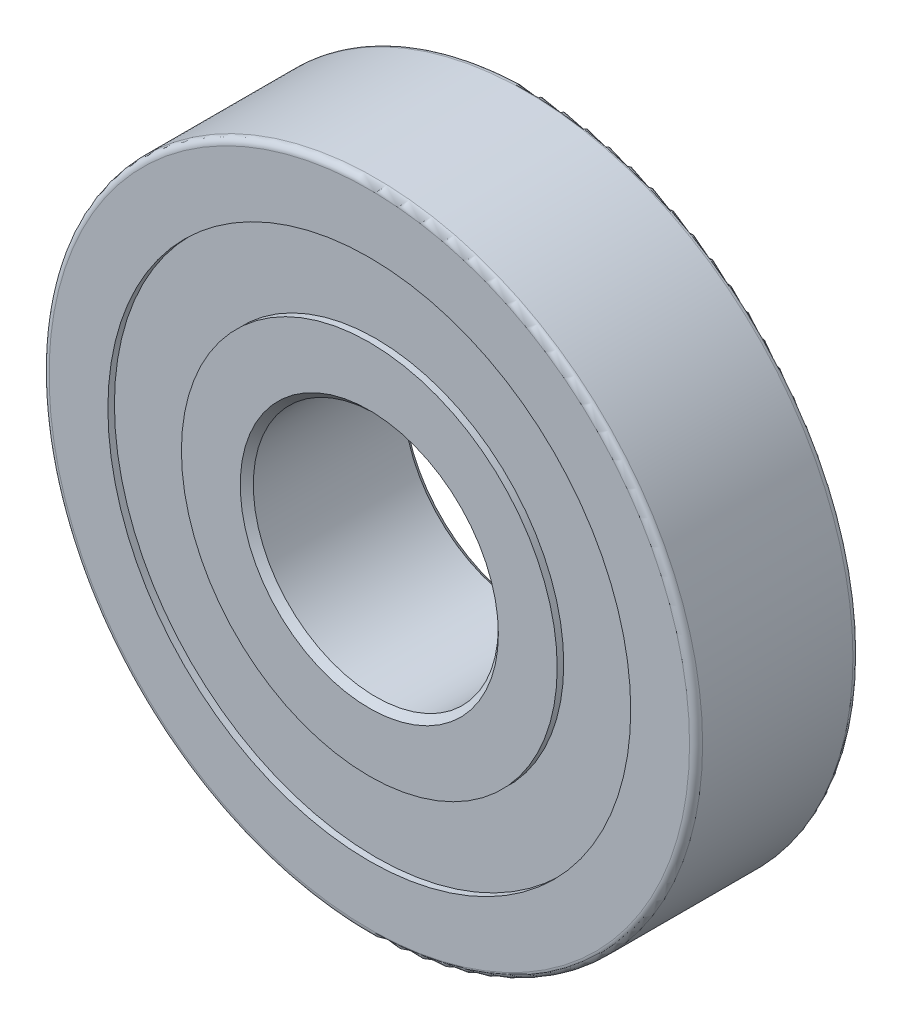
ISO-10303-21;
HEADER;
FILE_DESCRIPTION(('STEP AP214'),'2;1');
FILE_NAME('part.step','',(''),(''),'','','');
FILE_SCHEMA(('AUTOMOTIVE_DESIGN { 1 0 10303 214 1 1 1 1 }'));
ENDSEC;
DATA;
#1=APPLICATION_CONTEXT('core data for automotive mechanical design processes');
#2=APPLICATION_PROTOCOL_DEFINITION('international standard','automotive_design',2000,#1);
#3=PRODUCT_CONTEXT('',#1,'mechanical');
#4=PRODUCT('Part','Part','',(#3));
#5=PRODUCT_RELATED_PRODUCT_CATEGORY('part','',(#4));
#6=PRODUCT_DEFINITION_FORMATION('','',#4);
#7=PRODUCT_DEFINITION_CONTEXT('part definition',#1,'design');
#8=PRODUCT_DEFINITION('design','',#6,#7);
#9=PRODUCT_DEFINITION_SHAPE('','',#8);
#10=(LENGTH_UNIT() NAMED_UNIT(*) SI_UNIT(.MILLI.,.METRE.));
#11=(NAMED_UNIT(*) PLANE_ANGLE_UNIT() SI_UNIT($,.RADIAN.));
#12=(NAMED_UNIT(*) SI_UNIT($,.STERADIAN.) SOLID_ANGLE_UNIT());
#13=UNCERTAINTY_MEASURE_WITH_UNIT(LENGTH_MEASURE(1.E-05),#10,'distance_accuracy_value','');
#14=(GEOMETRIC_REPRESENTATION_CONTEXT(3) GLOBAL_UNCERTAINTY_ASSIGNED_CONTEXT((#13)) GLOBAL_UNIT_ASSIGNED_CONTEXT((#10,
#11,#12)) REPRESENTATION_CONTEXT('',''));
#15=CARTESIAN_POINT('',(0.,0.,0.));
#16=DIRECTION('',(0.,0.,1.));
#17=DIRECTION('',(1.,0.,0.));
#18=AXIS2_PLACEMENT_3D('',#15,#16,#17);
#19=CARTESIAN_POINT('',(0.,0.,1.5875));
#20=DIRECTION('',(0.,0.,-1.));
#21=DIRECTION('',(-1.,0.,0.));
#22=AXIS2_PLACEMENT_3D('',#19,#20,#21);
#23=CYLINDRICAL_SURFACE('',#22,5.08);
#24=CARTESIAN_POINT('',(0.,0.,-1.5875));
#25=DIRECTION('',(0.,0.,1.));
#26=DIRECTION('',(1.,0.,0.));
#27=AXIS2_PLACEMENT_3D('',#24,#25,#26);
#28=CIRCLE('',#27,5.08);
#29=CARTESIAN_POINT('',(5.08,0.,-1.5875));
#30=VERTEX_POINT('',#29);
#31=EDGE_CURVE('E72',#30,#30,#28,.T.);
#32=ORIENTED_EDGE('',*,*,#31,.F.);
#33=EDGE_LOOP('',(#32));
#34=FACE_BOUND('',#33,.T.);
#35=CARTESIAN_POINT('',(0.,0.,-1.4605));
#36=DIRECTION('',(0.,0.,1.));
#37=DIRECTION('',(1.,0.,0.));
#38=AXIS2_PLACEMENT_3D('',#35,#36,#37);
#39=CIRCLE('',#38,5.08);
#40=CARTESIAN_POINT('',(5.08,0.,-1.4605));
#41=VERTEX_POINT('',#40);
#42=EDGE_CURVE('E75',#41,#41,#39,.T.);
#43=ORIENTED_EDGE('',*,*,#42,.T.);
#44=EDGE_LOOP('',(#43));
#45=FACE_BOUND('',#44,.T.);
#46=ADVANCED_FACE('F36',(#34,#45),#23,.F.);
#47=CARTESIAN_POINT('',(0.,0.,1.4605));
#48=DIRECTION('',(0.,0.,1.));
#49=DIRECTION('',(1.,0.,0.));
#50=AXIS2_PLACEMENT_3D('',#47,#48,#49);
#51=CIRCLE('',#50,5.08);
#52=CARTESIAN_POINT('',(5.08,0.,1.4605));
#53=VERTEX_POINT('',#52);
#54=EDGE_CURVE('E68',#53,#53,#51,.T.);
#55=ORIENTED_EDGE('',*,*,#54,.F.);
#56=EDGE_LOOP('',(#55));
#57=FACE_BOUND('',#56,.T.);
#58=CARTESIAN_POINT('',(0.,0.,1.5875));
#59=DIRECTION('',(0.,0.,1.));
#60=DIRECTION('',(1.,0.,0.));
#61=AXIS2_PLACEMENT_3D('',#58,#59,#60);
#62=CIRCLE('',#61,5.08);
#63=CARTESIAN_POINT('',(5.08,0.,1.5875));
#64=VERTEX_POINT('',#63);
#65=EDGE_CURVE('E71',#64,#64,#62,.T.);
#66=ORIENTED_EDGE('',*,*,#65,.T.);
#67=EDGE_LOOP('',(#66));
#68=FACE_BOUND('',#67,.T.);
#69=ADVANCED_FACE('F113',(#57,#68),#23,.F.);
#70=CARTESIAN_POINT('',(0.,0.,1.5875));
#71=DIRECTION('',(0.,0.,-1.));
#72=DIRECTION('',(-1.,0.,0.));
#73=AXIS2_PLACEMENT_3D('',#70,#71,#72);
#74=CYLINDRICAL_SURFACE('',#73,6.35);
#75=CARTESIAN_POINT('',(0.,0.,-1.4605));
#76=DIRECTION('',(0.,0.,1.));
#77=DIRECTION('',(1.,0.,0.));
#78=AXIS2_PLACEMENT_3D('',#75,#76,#77);
#79=CIRCLE('',#78,6.35);
#80=CARTESIAN_POINT('',(6.35,0.,-1.4605));
#81=VERTEX_POINT('',#80);
#82=EDGE_CURVE('E62',#81,#81,#79,.T.);
#83=ORIENTED_EDGE('',*,*,#82,.T.);
#84=EDGE_LOOP('',(#83));
#85=FACE_BOUND('',#84,.T.);
#86=CARTESIAN_POINT('',(0.,0.,1.4605));
#87=DIRECTION('',(0.,0.,1.));
#88=DIRECTION('',(1.,0.,0.));
#89=AXIS2_PLACEMENT_3D('',#86,#87,#88);
#90=CIRCLE('',#89,6.35);
#91=CARTESIAN_POINT('',(6.35,0.,1.4605));
#92=VERTEX_POINT('',#91);
#93=EDGE_CURVE('E65',#92,#92,#90,.F.);
#94=ORIENTED_EDGE('',*,*,#93,.T.);
#95=EDGE_LOOP('',(#94));
#96=FACE_BOUND('',#95,.T.);
#97=ADVANCED_FACE('F119',(#85,#96),#74,.T.);
#98=CARTESIAN_POINT('',(0.,0.,1.5875));
#99=DIRECTION('',(0.,0.,1.));
#100=DIRECTION('',(1.,0.,0.));
#101=AXIS2_PLACEMENT_3D('',#98,#99,#100);
#102=PLANE('',#101);
#103=CARTESIAN_POINT('',(0.,0.,1.5875));
#104=DIRECTION('',(0.,0.,1.));
#105=DIRECTION('',(1.,0.,0.));
#106=AXIS2_PLACEMENT_3D('',#103,#104,#105);
#107=CIRCLE('',#106,6.223);
#108=CARTESIAN_POINT('',(6.223,0.,1.5875));
#109=VERTEX_POINT('',#108);
#110=EDGE_CURVE('E56',#109,#109,#107,.T.);
#111=ORIENTED_EDGE('',*,*,#110,.T.);
#112=EDGE_LOOP('',(#111));
#113=FACE_BOUND('',#112,.T.);
#114=ORIENTED_EDGE('',*,*,#65,.F.);
#115=EDGE_LOOP('',(#114));
#116=FACE_BOUND('',#115,.T.);
#117=ADVANCED_FACE('F161',(#113,#116),#102,.T.);
#118=CARTESIAN_POINT('',(0.,0.,-1.5875));
#119=DIRECTION('',(0.,0.,1.));
#120=DIRECTION('',(1.,0.,0.));
#121=AXIS2_PLACEMENT_3D('',#118,#119,#120);
#122=PLANE('',#121);
#123=CARTESIAN_POINT('',(0.,0.,-1.5875));
#124=DIRECTION('',(0.,0.,1.));
#125=DIRECTION('',(1.,0.,0.));
#126=AXIS2_PLACEMENT_3D('',#123,#124,#125);
#127=CIRCLE('',#126,6.223);
#128=CARTESIAN_POINT('',(6.223,0.,-1.5875));
#129=VERTEX_POINT('',#128);
#130=EDGE_CURVE('E59',#129,#129,#127,.F.);
#131=ORIENTED_EDGE('',*,*,#130,.T.);
#132=EDGE_LOOP('',(#131));
#133=FACE_BOUND('',#132,.T.);
#134=ORIENTED_EDGE('',*,*,#31,.T.);
#135=EDGE_LOOP('',(#134));
#136=FACE_BOUND('',#135,.T.);
#137=ADVANCED_FACE('F156',(#133,#136),#122,.F.);
#138=CARTESIAN_POINT('',(0.,0.,1.4605));
#139=DIRECTION('',(0.,0.,1.));
#140=DIRECTION('',(1.,0.,0.));
#141=AXIS2_PLACEMENT_3D('',#138,#139,#140);
#142=PLANE('',#141);
#143=ORIENTED_EDGE('',*,*,#54,.T.);
#144=EDGE_LOOP('',(#143));
#145=FACE_BOUND('',#144,.T.);
#146=CARTESIAN_POINT('',(0.,0.,1.4605));
#147=DIRECTION('',(0.,0.,1.));
#148=DIRECTION('',(1.,0.,0.));
#149=AXIS2_PLACEMENT_3D('',#146,#147,#148);
#150=CIRCLE('',#149,3.65125);
#151=CARTESIAN_POINT('',(3.65125,0.,1.4605));
#152=VERTEX_POINT('',#151);
#153=EDGE_CURVE('E80',#152,#152,#150,.T.);
#154=ORIENTED_EDGE('',*,*,#153,.F.);
#155=EDGE_LOOP('',(#154));
#156=FACE_BOUND('',#155,.T.);
#157=ADVANCED_FACE('F150',(#145,#156),#142,.T.);
#158=CARTESIAN_POINT('',(0.,0.,-1.4605));
#159=DIRECTION('',(0.,0.,1.));
#160=DIRECTION('',(1.,0.,0.));
#161=AXIS2_PLACEMENT_3D('',#158,#159,#160);
#162=PLANE('',#161);
#163=ORIENTED_EDGE('',*,*,#42,.F.);
#164=EDGE_LOOP('',(#163));
#165=FACE_BOUND('',#164,.T.);
#166=CARTESIAN_POINT('',(0.,0.,-1.4605));
#167=DIRECTION('',(0.,0.,1.));
#168=DIRECTION('',(1.,0.,0.));
#169=AXIS2_PLACEMENT_3D('',#166,#167,#168);
#170=CIRCLE('',#169,3.65125);
#171=CARTESIAN_POINT('',(3.65125,0.,-1.4605));
#172=VERTEX_POINT('',#171);
#173=EDGE_CURVE('E83',#172,#172,#170,.F.);
#174=ORIENTED_EDGE('',*,*,#173,.F.);
#175=EDGE_LOOP('',(#174));
#176=FACE_BOUND('',#175,.T.);
#177=ADVANCED_FACE('F110',(#165,#176),#162,.F.);
#178=CARTESIAN_POINT('',(0.,0.,1.5875));
#179=DIRECTION('',(0.,0.,-1.));
#180=DIRECTION('',(-1.,0.,0.));
#181=AXIS2_PLACEMENT_3D('',#178,#179,#180);
#182=CYLINDRICAL_SURFACE('',#181,3.65125);
#183=CARTESIAN_POINT('',(0.,0.,-1.5875));
#184=DIRECTION('',(0.,0.,1.));
#185=DIRECTION('',(1.,0.,0.));
#186=AXIS2_PLACEMENT_3D('',#183,#184,#185);
#187=CIRCLE('',#186,3.65125);
#188=CARTESIAN_POINT('',(3.65125,0.,-1.5875));
#189=VERTEX_POINT('',#188);
#190=EDGE_CURVE('E87',#189,#189,#187,.T.);
#191=ORIENTED_EDGE('',*,*,#190,.T.);
#192=EDGE_LOOP('',(#191));
#193=FACE_BOUND('',#192,.T.);
#194=ORIENTED_EDGE('',*,*,#173,.T.);
#195=EDGE_LOOP('',(#194));
#196=FACE_BOUND('',#195,.T.);
#197=ADVANCED_FACE('F100',(#193,#196),#182,.T.);
#198=CARTESIAN_POINT('',(0.,0.,1.5875));
#199=DIRECTION('',(0.,0.,-1.));
#200=DIRECTION('',(-1.,0.,0.));
#201=AXIS2_PLACEMENT_3D('',#198,#199,#200);
#202=CYLINDRICAL_SURFACE('',#201,2.38125);
#203=CARTESIAN_POINT('',(0.,0.,-1.4605));
#204=DIRECTION('',(0.,0.,1.));
#205=DIRECTION('',(1.,0.,0.));
#206=AXIS2_PLACEMENT_3D('',#203,#204,#205);
#207=CIRCLE('',#206,2.38125);
#208=CARTESIAN_POINT('',(2.38125,0.,-1.4605));
#209=VERTEX_POINT('',#208);
#210=EDGE_CURVE('E43',#209,#209,#207,.F.);
#211=ORIENTED_EDGE('',*,*,#210,.T.);
#212=EDGE_LOOP('',(#211));
#213=FACE_BOUND('',#212,.T.);
#214=CARTESIAN_POINT('',(0.,0.,1.4605));
#215=DIRECTION('',(0.,0.,1.));
#216=DIRECTION('',(1.,0.,0.));
#217=AXIS2_PLACEMENT_3D('',#214,#215,#216);
#218=CIRCLE('',#217,2.38125);
#219=CARTESIAN_POINT('',(2.38125,0.,1.4605));
#220=VERTEX_POINT('',#219);
#221=EDGE_CURVE('E47',#220,#220,#218,.T.);
#222=ORIENTED_EDGE('',*,*,#221,.T.);
#223=EDGE_LOOP('',(#222));
#224=FACE_BOUND('',#223,.T.);
#225=ADVANCED_FACE('F97',(#213,#224),#202,.F.);
#226=ORIENTED_EDGE('',*,*,#153,.T.);
#227=EDGE_LOOP('',(#226));
#228=FACE_BOUND('',#227,.T.);
#229=CARTESIAN_POINT('',(0.,0.,1.5875));
#230=DIRECTION('',(0.,0.,1.));
#231=DIRECTION('',(1.,0.,0.));
#232=AXIS2_PLACEMENT_3D('',#229,#230,#231);
#233=CIRCLE('',#232,3.65125);
#234=CARTESIAN_POINT('',(3.65125,0.,1.5875));
#235=VERTEX_POINT('',#234);
#236=EDGE_CURVE('E86',#235,#235,#233,.T.);
#237=ORIENTED_EDGE('',*,*,#236,.F.);
#238=EDGE_LOOP('',(#237));
#239=FACE_BOUND('',#238,.T.);
#240=ADVANCED_FACE('F95',(#228,#239),#182,.T.);
#241=CARTESIAN_POINT('',(0.,0.,1.5875));
#242=DIRECTION('',(0.,0.,1.));
#243=DIRECTION('',(1.,0.,0.));
#244=AXIS2_PLACEMENT_3D('',#241,#242,#243);
#245=PLANE('',#244);
#246=CARTESIAN_POINT('',(0.,0.,1.5875));
#247=DIRECTION('',(0.,0.,1.));
#248=DIRECTION('',(1.,0.,0.));
#249=AXIS2_PLACEMENT_3D('',#246,#247,#248);
#250=CIRCLE('',#249,2.50825);
#251=CARTESIAN_POINT('',(2.50825,0.,1.5875));
#252=VERTEX_POINT('',#251);
#253=EDGE_CURVE('E11',#252,#252,#250,.F.);
#254=ORIENTED_EDGE('',*,*,#253,.T.);
#255=EDGE_LOOP('',(#254));
#256=FACE_BOUND('',#255,.T.);
#257=ORIENTED_EDGE('',*,*,#236,.T.);
#258=EDGE_LOOP('',(#257));
#259=FACE_BOUND('',#258,.T.);
#260=ADVANCED_FACE('F93',(#256,#259),#245,.T.);
#261=CARTESIAN_POINT('',(0.,0.,-1.5875));
#262=DIRECTION('',(0.,0.,1.));
#263=DIRECTION('',(1.,0.,0.));
#264=AXIS2_PLACEMENT_3D('',#261,#262,#263);
#265=PLANE('',#264);
#266=CARTESIAN_POINT('',(0.,0.,-1.5875));
#267=DIRECTION('',(0.,0.,1.));
#268=DIRECTION('',(1.,0.,0.));
#269=AXIS2_PLACEMENT_3D('',#266,#267,#268);
#270=CIRCLE('',#269,2.50825);
#271=CARTESIAN_POINT('',(2.50825,0.,-1.5875));
#272=VERTEX_POINT('',#271);
#273=EDGE_CURVE('E51',#272,#272,#270,.T.);
#274=ORIENTED_EDGE('',*,*,#273,.T.);
#275=EDGE_LOOP('',(#274));
#276=FACE_BOUND('',#275,.T.);
#277=ORIENTED_EDGE('',*,*,#190,.F.);
#278=EDGE_LOOP('',(#277));
#279=FACE_BOUND('',#278,.T.);
#280=ADVANCED_FACE('F105',(#276,#279),#265,.F.);
#281=CARTESIAN_POINT('',(0.,0.,-1.4605));
#282=DIRECTION('',(0.,0.,1.));
#283=DIRECTION('',(1.,0.,0.));
#284=AXIS2_PLACEMENT_3D('',#281,#282,#283);
#285=TOROIDAL_SURFACE('',#284,6.223,0.127);
#286=ORIENTED_EDGE('',*,*,#130,.F.);
#287=EDGE_LOOP('',(#286));
#288=FACE_BOUND('',#287,.T.);
#289=ORIENTED_EDGE('',*,*,#82,.F.);
#290=EDGE_LOOP('',(#289));
#291=FACE_BOUND('',#290,.T.);
#292=ADVANCED_FACE('F126',(#288,#291),#285,.T.);
#293=CARTESIAN_POINT('',(0.,0.,1.4605));
#294=DIRECTION('',(0.,0.,1.));
#295=DIRECTION('',(1.,0.,0.));
#296=AXIS2_PLACEMENT_3D('',#293,#294,#295);
#297=TOROIDAL_SURFACE('',#296,6.223,0.127);
#298=ORIENTED_EDGE('',*,*,#93,.F.);
#299=EDGE_LOOP('',(#298));
#300=FACE_BOUND('',#299,.T.);
#301=ORIENTED_EDGE('',*,*,#110,.F.);
#302=EDGE_LOOP('',(#301));
#303=FACE_BOUND('',#302,.T.);
#304=ADVANCED_FACE('F129',(#300,#303),#297,.T.);
#305=CARTESIAN_POINT('',(0.,0.,-1.5875));
#306=DIRECTION('',(0.,0.,-1.));
#307=DIRECTION('',(-1.,0.,0.));
#308=AXIS2_PLACEMENT_3D('',#305,#306,#307);
#309=CONICAL_SURFACE('',#308,2.50825,0.785398163397448);
#310=ORIENTED_EDGE('',*,*,#210,.F.);
#311=EDGE_LOOP('',(#310));
#312=FACE_BOUND('',#311,.T.);
#313=ORIENTED_EDGE('',*,*,#273,.F.);
#314=EDGE_LOOP('',(#313));
#315=FACE_BOUND('',#314,.T.);
#316=ADVANCED_FACE('F132',(#312,#315),#309,.F.);
#317=CARTESIAN_POINT('',(0.,0.,1.4605));
#318=DIRECTION('',(0.,0.,1.));
#319=DIRECTION('',(1.,0.,0.));
#320=AXIS2_PLACEMENT_3D('',#317,#318,#319);
#321=CONICAL_SURFACE('',#320,2.38125,0.785398163397448);
#322=ORIENTED_EDGE('',*,*,#253,.F.);
#323=EDGE_LOOP('',(#322));
#324=FACE_BOUND('',#323,.T.);
#325=ORIENTED_EDGE('',*,*,#221,.F.);
#326=EDGE_LOOP('',(#325));
#327=FACE_BOUND('',#326,.T.);
#328=ADVANCED_FACE('F38',(#324,#327),#321,.F.);
#329=CLOSED_SHELL('',(#46,#69,#97,#117,#137,#157,#177,#197,#225,#240,#260,#280,#292,#304,#316,#328));
#330=MANIFOLD_SOLID_BREP('B2',#329);
#331=ADVANCED_BREP_SHAPE_REPRESENTATION('',(#18,#330),#14);
#332=SHAPE_DEFINITION_REPRESENTATION(#9,#331);
ENDSEC;
END-ISO-10303-21;
